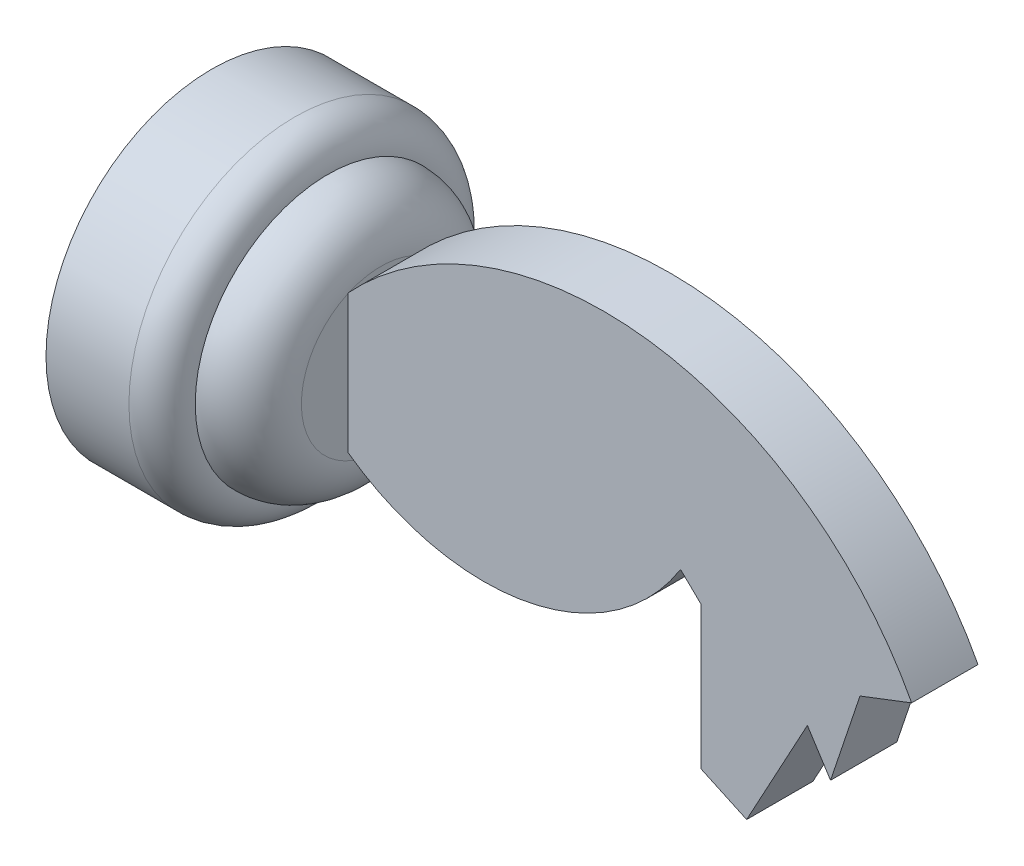
ISO-10303-21;
HEADER;
FILE_DESCRIPTION(('STEP AP214'),'2;1');
FILE_NAME('part.step','',(''),(''),'','','');
FILE_SCHEMA(('AUTOMOTIVE_DESIGN { 1 0 10303 214 1 1 1 1 }'));
ENDSEC;
DATA;
#1=APPLICATION_CONTEXT('core data for automotive mechanical design processes');
#2=APPLICATION_PROTOCOL_DEFINITION('international standard','automotive_design',2000,#1);
#3=PRODUCT_CONTEXT('',#1,'mechanical');
#4=PRODUCT('Part','Part','',(#3));
#5=PRODUCT_RELATED_PRODUCT_CATEGORY('part','',(#4));
#6=PRODUCT_DEFINITION_FORMATION('','',#4);
#7=PRODUCT_DEFINITION_CONTEXT('part definition',#1,'design');
#8=PRODUCT_DEFINITION('design','',#6,#7);
#9=PRODUCT_DEFINITION_SHAPE('','',#8);
#10=(LENGTH_UNIT() NAMED_UNIT(*) SI_UNIT(.MILLI.,.METRE.));
#11=(NAMED_UNIT(*) PLANE_ANGLE_UNIT() SI_UNIT($,.RADIAN.));
#12=(NAMED_UNIT(*) SI_UNIT($,.STERADIAN.) SOLID_ANGLE_UNIT());
#13=UNCERTAINTY_MEASURE_WITH_UNIT(LENGTH_MEASURE(1.E-05),#10,'distance_accuracy_value','');
#14=(GEOMETRIC_REPRESENTATION_CONTEXT(3) GLOBAL_UNCERTAINTY_ASSIGNED_CONTEXT((#13)) GLOBAL_UNIT_ASSIGNED_CONTEXT((#10,
#11,#12)) REPRESENTATION_CONTEXT('',''));
#15=CARTESIAN_POINT('',(0.,0.,0.));
#16=DIRECTION('',(0.,0.,1.));
#17=DIRECTION('',(1.,0.,0.));
#18=AXIS2_PLACEMENT_3D('',#15,#16,#17);
#19=CARTESIAN_POINT('',(11.2,0.,0.));
#20=DIRECTION('',(1.,0.,0.));
#21=DIRECTION('',(0.,0.,-1.));
#22=AXIS2_PLACEMENT_3D('',#19,#20,#21);
#23=PLANE('',#22);
#24=DIRECTION('',(0.,0.,-1.));
#25=VECTOR('',#24,1.);
#26=CARTESIAN_POINT('',(11.2,4.4,2.));
#27=LINE('',#26,#25);
#28=CARTESIAN_POINT('',(11.2,4.4,1.91833260932509));
#29=VERTEX_POINT('',#28);
#30=CARTESIAN_POINT('',(11.2,4.4,-1.91833260932509));
#31=VERTEX_POINT('',#30);
#32=EDGE_CURVE('E156',#29,#31,#27,.T.);
#33=ORIENTED_EDGE('',*,*,#32,.T.);
#34=CARTESIAN_POINT('',(11.2,0.,0.));
#35=DIRECTION('',(-1.,0.,0.));
#36=DIRECTION('',(0.,0.,1.));
#37=AXIS2_PLACEMENT_3D('',#34,#35,#36);
#38=CIRCLE('',#37,4.8);
#39=EDGE_CURVE('E236',#29,#31,#38,.T.);
#40=ORIENTED_EDGE('',*,*,#39,.F.);
#41=EDGE_LOOP('',(#33,#40));
#42=FACE_BOUND('',#41,.T.);
#43=ADVANCED_FACE('F46',(#42),#23,.T.);
#44=CARTESIAN_POINT('',(0.,0.,0.));
#45=DIRECTION('',(-1.,0.,0.));
#46=DIRECTION('',(0.,0.,1.));
#47=AXIS2_PLACEMENT_3D('',#44,#45,#46);
#48=CYLINDRICAL_SURFACE('',#47,10.);
#49=CARTESIAN_POINT('',(6.,0.,0.));
#50=DIRECTION('',(-1.,0.,0.));
#51=DIRECTION('',(0.,0.,1.));
#52=AXIS2_PLACEMENT_3D('',#49,#50,#51);
#53=CIRCLE('',#52,10.);
#54=CARTESIAN_POINT('',(6.,0.,10.));
#55=VERTEX_POINT('',#54);
#56=EDGE_CURVE('E157',#55,#55,#53,.T.);
#57=ORIENTED_EDGE('',*,*,#56,.T.);
#58=EDGE_LOOP('',(#57));
#59=FACE_BOUND('',#58,.T.);
#60=CARTESIAN_POINT('',(0.999999999999999,0.,0.));
#61=DIRECTION('',(-1.,0.,0.));
#62=DIRECTION('',(0.,0.,1.));
#63=AXIS2_PLACEMENT_3D('',#60,#61,#62);
#64=CIRCLE('',#63,10.);
#65=CARTESIAN_POINT('',(0.999999999999999,0.,10.));
#66=VERTEX_POINT('',#65);
#67=EDGE_CURVE('E11',#66,#66,#64,.T.);
#68=ORIENTED_EDGE('',*,*,#67,.F.);
#69=EDGE_LOOP('',(#68));
#70=FACE_BOUND('',#69,.T.);
#71=ADVANCED_FACE('F48',(#59,#70),#48,.T.);
#72=CARTESIAN_POINT('',(0.999999999999999,0.,0.));
#73=DIRECTION('',(1.,0.,0.));
#74=DIRECTION('',(0.,0.,-1.));
#75=AXIS2_PLACEMENT_3D('',#72,#73,#74);
#76=PLANE('',#75);
#77=ORIENTED_EDGE('',*,*,#67,.T.);
#78=EDGE_LOOP('',(#77));
#79=FACE_BOUND('',#78,.T.);
#80=ADVANCED_FACE('F255',(#79),#76,.F.);
#81=DIRECTION('',(0.,1.,0.));
#82=VECTOR('',#81,1.);
#83=CARTESIAN_POINT('',(11.2,0.,2.));
#84=LINE('',#83,#82);
#85=CARTESIAN_POINT('',(11.2,-3.91497825520678,2.));
#86=VERTEX_POINT('',#85);
#87=CARTESIAN_POINT('',(11.2,4.36348484585429,2.));
#88=VERTEX_POINT('',#87);
#89=EDGE_CURVE('E148',#86,#88,#84,.T.);
#90=ORIENTED_EDGE('',*,*,#89,.T.);
#91=CARTESIAN_POINT('',(11.2,4.36348484585429,-2.));
#92=VERTEX_POINT('',#91);
#93=EDGE_CURVE('E233',#92,#88,#38,.T.);
#94=ORIENTED_EDGE('',*,*,#93,.F.);
#95=DIRECTION('',(0.,1.,0.));
#96=VECTOR('',#95,1.);
#97=CARTESIAN_POINT('',(11.2,0.,-2.));
#98=LINE('',#97,#96);
#99=CARTESIAN_POINT('',(11.2,-3.91497825520678,-2.));
#100=VERTEX_POINT('',#99);
#101=EDGE_CURVE('E62',#100,#92,#98,.T.);
#102=ORIENTED_EDGE('',*,*,#101,.F.);
#103=DIRECTION('',(0.,0.,-1.));
#104=VECTOR('',#103,1.);
#105=CARTESIAN_POINT('',(11.2,-3.91497825520678,2.));
#106=LINE('',#105,#104);
#107=EDGE_CURVE('E226',#86,#100,#106,.T.);
#108=ORIENTED_EDGE('',*,*,#107,.F.);
#109=EDGE_LOOP('',(#90,#94,#102,#108));
#110=FACE_BOUND('',#109,.T.);
#111=ADVANCED_FACE('F257',(#110),#23,.T.);
#112=CARTESIAN_POINT('',(8.,0.,0.));
#113=DIRECTION('',(-1.,0.,0.));
#114=DIRECTION('',(0.,0.,1.));
#115=AXIS2_PLACEMENT_3D('',#112,#113,#114);
#116=TOROIDAL_SURFACE('',#115,4.8,3.2);
#117=CARTESIAN_POINT('',(8.,0.,0.));
#118=DIRECTION('',(-1.,0.,0.));
#119=DIRECTION('',(0.,0.,1.));
#120=AXIS2_PLACEMENT_3D('',#117,#118,#119);
#121=CIRCLE('',#120,8.);
#122=CARTESIAN_POINT('',(8.,0.,8.));
#123=VERTEX_POINT('',#122);
#124=EDGE_CURVE('E230',#123,#123,#121,.T.);
#125=ORIENTED_EDGE('',*,*,#124,.F.);
#126=EDGE_LOOP('',(#125));
#127=FACE_BOUND('',#126,.T.);
#128=EDGE_CURVE('E144',#88,#29,#38,.T.);
#129=ORIENTED_EDGE('',*,*,#128,.T.);
#130=ORIENTED_EDGE('',*,*,#39,.T.);
#131=EDGE_CURVE('E69',#31,#92,#38,.T.);
#132=ORIENTED_EDGE('',*,*,#131,.T.);
#133=ORIENTED_EDGE('',*,*,#93,.T.);
#134=EDGE_LOOP('',(#129,#130,#132,#133));
#135=FACE_BOUND('',#134,.T.);
#136=ADVANCED_FACE('F263',(#127,#135),#116,.T.);
#137=CARTESIAN_POINT('',(6.,0.,0.));
#138=DIRECTION('',(-1.,0.,0.));
#139=DIRECTION('',(0.,0.,1.));
#140=AXIS2_PLACEMENT_3D('',#137,#138,#139);
#141=TOROIDAL_SURFACE('',#140,8.,2.);
#142=ORIENTED_EDGE('',*,*,#124,.T.);
#143=EDGE_LOOP('',(#142));
#144=FACE_BOUND('',#143,.T.);
#145=ORIENTED_EDGE('',*,*,#56,.F.);
#146=EDGE_LOOP('',(#145));
#147=FACE_BOUND('',#146,.T.);
#148=ADVANCED_FACE('F294',(#144,#147),#141,.T.);
#149=CARTESIAN_POINT('',(11.2,0.,2.));
#150=DIRECTION('',(-1.,0.,0.));
#151=DIRECTION('',(0.,0.,1.));
#152=AXIS2_PLACEMENT_3D('',#149,#150,#151);
#153=PLANE('',#152);
#154=ORIENTED_EDGE('',*,*,#128,.F.);
#155=CARTESIAN_POINT('',(11.2,4.4,2.));
#156=VERTEX_POINT('',#155);
#157=EDGE_CURVE('E138',#88,#156,#84,.T.);
#158=ORIENTED_EDGE('',*,*,#157,.T.);
#159=EDGE_CURVE('E141',#156,#29,#27,.T.);
#160=ORIENTED_EDGE('',*,*,#159,.T.);
#161=EDGE_LOOP('',(#154,#158,#160));
#162=FACE_BOUND('',#161,.T.);
#163=ADVANCED_FACE('F140',(#162),#153,.T.);
#164=CARTESIAN_POINT('',(26.6430950023222,-9.83062952751044,2.));
#165=DIRECTION('',(0.,0.,-1.));
#166=DIRECTION('',(-1.,0.,0.));
#167=AXIS2_PLACEMENT_3D('',#164,#165,#166);
#168=CYLINDRICAL_SURFACE('',#167,21.);
#169=CARTESIAN_POINT('',(26.6430950023222,-9.83062952751044,-2.));
#170=DIRECTION('',(0.,0.,1.));
#171=DIRECTION('',(1.,0.,0.));
#172=AXIS2_PLACEMENT_3D('',#169,#170,#171);
#173=CIRCLE('',#172,21.);
#174=CARTESIAN_POINT('',(11.2,4.4,-2.));
#175=VERTEX_POINT('',#174);
#176=CARTESIAN_POINT('',(45.2,0.,-2.));
#177=VERTEX_POINT('',#176);
#178=EDGE_CURVE('E187',#175,#177,#173,.F.);
#179=ORIENTED_EDGE('',*,*,#178,.F.);
#180=EDGE_CURVE('E159',#31,#175,#27,.T.);
#181=ORIENTED_EDGE('',*,*,#180,.F.);
#182=ORIENTED_EDGE('',*,*,#32,.F.);
#183=ORIENTED_EDGE('',*,*,#159,.F.);
#184=CARTESIAN_POINT('',(26.6430950023222,-9.83062952751044,2.));
#185=DIRECTION('',(0.,0.,1.));
#186=DIRECTION('',(1.,0.,0.));
#187=AXIS2_PLACEMENT_3D('',#184,#185,#186);
#188=CIRCLE('',#187,21.);
#189=CARTESIAN_POINT('',(45.2,0.,2.));
#190=VERTEX_POINT('',#189);
#191=EDGE_CURVE('E149',#156,#190,#188,.F.);
#192=ORIENTED_EDGE('',*,*,#191,.T.);
#193=DIRECTION('',(0.,0.,-1.));
#194=VECTOR('',#193,1.);
#195=CARTESIAN_POINT('',(45.2,0.,2.));
#196=LINE('',#195,#194);
#197=EDGE_CURVE('E186',#190,#177,#196,.T.);
#198=ORIENTED_EDGE('',*,*,#197,.T.);
#199=EDGE_LOOP('',(#179,#181,#182,#183,#192,#198));
#200=FACE_BOUND('',#199,.T.);
#201=ADVANCED_FACE('F154',(#200),#168,.T.);
#202=ORIENTED_EDGE('',*,*,#131,.F.);
#203=ORIENTED_EDGE('',*,*,#180,.T.);
#204=EDGE_CURVE('E190',#92,#175,#98,.T.);
#205=ORIENTED_EDGE('',*,*,#204,.F.);
#206=EDGE_LOOP('',(#202,#203,#205));
#207=FACE_BOUND('',#206,.T.);
#208=ADVANCED_FACE('F332',(#207),#153,.T.);
#209=CARTESIAN_POINT('',(19.3994308478551,7.43267937847441,2.));
#210=DIRECTION('',(0.,0.,-1.));
#211=DIRECTION('',(-1.,0.,0.));
#212=AXIS2_PLACEMENT_3D('',#209,#210,#211);
#213=CYLINDRICAL_SURFACE('',#212,14.);
#214=CARTESIAN_POINT('',(19.3994308478551,7.43267937847441,-2.));
#215=DIRECTION('',(0.,0.,1.));
#216=DIRECTION('',(1.,0.,0.));
#217=AXIS2_PLACEMENT_3D('',#214,#215,#216);
#218=CIRCLE('',#217,14.);
#219=CARTESIAN_POINT('',(31.263463773332,0.,-2.));
#220=VERTEX_POINT('',#219);
#221=EDGE_CURVE('E192',#220,#100,#218,.F.);
#222=ORIENTED_EDGE('',*,*,#221,.F.);
#223=DIRECTION('',(0.,0.,-1.));
#224=VECTOR('',#223,1.);
#225=CARTESIAN_POINT('',(31.263463773332,0.,2.));
#226=LINE('',#225,#224);
#227=CARTESIAN_POINT('',(31.263463773332,0.,2.));
#228=VERTEX_POINT('',#227);
#229=EDGE_CURVE('E224',#228,#220,#226,.T.);
#230=ORIENTED_EDGE('',*,*,#229,.F.);
#231=CARTESIAN_POINT('',(19.3994308478551,7.43267937847441,2.));
#232=DIRECTION('',(0.,0.,1.));
#233=DIRECTION('',(1.,0.,0.));
#234=AXIS2_PLACEMENT_3D('',#231,#232,#233);
#235=CIRCLE('',#234,14.);
#236=EDGE_CURVE('E170',#228,#86,#235,.F.);
#237=ORIENTED_EDGE('',*,*,#236,.T.);
#238=ORIENTED_EDGE('',*,*,#107,.T.);
#239=EDGE_LOOP('',(#222,#230,#237,#238));
#240=FACE_BOUND('',#239,.T.);
#241=ADVANCED_FACE('F347',(#240),#213,.T.);
#242=CARTESIAN_POINT('',(15.1403569656046,15.6240069272758,2.));
#243=DIRECTION('',(0.695904285191115,0.71813454578696,0.));
#244=DIRECTION('',(-0.71813454578696,0.695904285191115,0.));
#245=AXIS2_PLACEMENT_3D('',#242,#243,#244);
#246=PLANE('',#245);
#247=DIRECTION('',(0.71813454578696,-0.695904285191115,0.));
#248=VECTOR('',#247,1.);
#249=CARTESIAN_POINT('',(15.1403569656046,15.6240069272758,-2.));
#250=LINE('',#249,#248);
#251=CARTESIAN_POINT('',(32.498964702066,-1.19725529945281,-2.));
#252=VERTEX_POINT('',#251);
#253=EDGE_CURVE('E194',#220,#252,#250,.T.);
#254=ORIENTED_EDGE('',*,*,#253,.T.);
#255=DIRECTION('',(0.,0.,-1.));
#256=VECTOR('',#255,1.);
#257=CARTESIAN_POINT('',(32.498964702066,-1.19725529945281,2.));
#258=LINE('',#257,#256);
#259=CARTESIAN_POINT('',(32.498964702066,-1.19725529945281,2.));
#260=VERTEX_POINT('',#259);
#261=EDGE_CURVE('E221',#260,#252,#258,.T.);
#262=ORIENTED_EDGE('',*,*,#261,.F.);
#263=DIRECTION('',(0.71813454578696,-0.695904285191115,0.));
#264=VECTOR('',#263,1.);
#265=CARTESIAN_POINT('',(15.1403569656046,15.6240069272758,2.));
#266=LINE('',#265,#264);
#267=EDGE_CURVE('E173',#228,#260,#266,.T.);
#268=ORIENTED_EDGE('',*,*,#267,.F.);
#269=ORIENTED_EDGE('',*,*,#229,.T.);
#270=EDGE_LOOP('',(#254,#262,#268,#269));
#271=FACE_BOUND('',#270,.T.);
#272=ADVANCED_FACE('F353',(#271),#246,.F.);
#273=CARTESIAN_POINT('',(32.498964702066,0.,2.));
#274=DIRECTION('',(1.,0.,0.));
#275=DIRECTION('',(0.,0.,-1.));
#276=AXIS2_PLACEMENT_3D('',#273,#274,#275);
#277=PLANE('',#276);
#278=DIRECTION('',(0.,-1.,0.));
#279=VECTOR('',#278,1.);
#280=CARTESIAN_POINT('',(32.498964702066,0.,-2.));
#281=LINE('',#280,#279);
#282=CARTESIAN_POINT('',(32.498964702066,-9.79725529945281,-2.));
#283=VERTEX_POINT('',#282);
#284=EDGE_CURVE('E196',#252,#283,#281,.T.);
#285=ORIENTED_EDGE('',*,*,#284,.T.);
#286=DIRECTION('',(0.,0.,-1.));
#287=VECTOR('',#286,1.);
#288=CARTESIAN_POINT('',(32.498964702066,-9.79725529945281,2.));
#289=LINE('',#288,#287);
#290=CARTESIAN_POINT('',(32.498964702066,-9.79725529945281,2.));
#291=VERTEX_POINT('',#290);
#292=EDGE_CURVE('E218',#291,#283,#289,.T.);
#293=ORIENTED_EDGE('',*,*,#292,.F.);
#294=DIRECTION('',(0.,-1.,0.));
#295=VECTOR('',#294,1.);
#296=CARTESIAN_POINT('',(32.498964702066,0.,2.));
#297=LINE('',#296,#295);
#298=EDGE_CURVE('E175',#260,#291,#297,.T.);
#299=ORIENTED_EDGE('',*,*,#298,.F.);
#300=ORIENTED_EDGE('',*,*,#261,.T.);
#301=EDGE_LOOP('',(#285,#293,#299,#300));
#302=FACE_BOUND('',#301,.T.);
#303=ADVANCED_FACE('F362',(#302),#277,.F.);
#304=CARTESIAN_POINT('',(1.99946445082386,4.3197897508319,2.));
#305=DIRECTION('',(0.420047755956167,0.907502001494316,0.));
#306=DIRECTION('',(-0.907502001494316,0.420047755956167,0.));
#307=AXIS2_PLACEMENT_3D('',#304,#305,#306);
#308=PLANE('',#307);
#309=DIRECTION('',(0.907502001494316,-0.420047755956167,0.));
#310=VECTOR('',#309,1.);
#311=CARTESIAN_POINT('',(1.99946445082386,4.3197897508319,-2.));
#312=LINE('',#311,#310);
#313=CARTESIAN_POINT('',(35.2486957665938,-11.07,-2.));
#314=VERTEX_POINT('',#313);
#315=EDGE_CURVE('E198',#283,#314,#312,.T.);
#316=ORIENTED_EDGE('',*,*,#315,.T.);
#317=DIRECTION('',(0.,0.,-1.));
#318=VECTOR('',#317,1.);
#319=CARTESIAN_POINT('',(35.2486957665938,-11.07,2.));
#320=LINE('',#319,#318);
#321=CARTESIAN_POINT('',(35.2486957665938,-11.07,2.));
#322=VERTEX_POINT('',#321);
#323=EDGE_CURVE('E215',#322,#314,#320,.T.);
#324=ORIENTED_EDGE('',*,*,#323,.F.);
#325=DIRECTION('',(0.907502001494316,-0.420047755956167,0.));
#326=VECTOR('',#325,1.);
#327=CARTESIAN_POINT('',(1.99946445082386,4.3197897508319,2.));
#328=LINE('',#327,#326);
#329=EDGE_CURVE('E177',#291,#322,#328,.T.);
#330=ORIENTED_EDGE('',*,*,#329,.F.);
#331=ORIENTED_EDGE('',*,*,#292,.T.);
#332=EDGE_LOOP('',(#316,#324,#330,#331));
#333=FACE_BOUND('',#332,.T.);
#334=ADVANCED_FACE('F371',(#333),#308,.F.);
#335=CARTESIAN_POINT('',(31.8696932080387,-17.2961223907554,2.));
#336=DIRECTION('',(-0.87890625,0.47699455312502,0.));
#337=DIRECTION('',(-0.47699455312502,-0.87890625,0.));
#338=AXIS2_PLACEMENT_3D('',#335,#336,#337);
#339=PLANE('',#338);
#340=DIRECTION('',(0.47699455312502,0.87890625,0.));
#341=VECTOR('',#340,1.);
#342=CARTESIAN_POINT('',(31.8696932080387,-17.2961223907554,-2.));
#343=LINE('',#342,#341);
#344=CARTESIAN_POINT('',(38.9120139345939,-4.32,-2.));
#345=VERTEX_POINT('',#344);
#346=EDGE_CURVE('E200',#314,#345,#343,.T.);
#347=ORIENTED_EDGE('',*,*,#346,.T.);
#348=DIRECTION('',(0.,0.,-1.));
#349=VECTOR('',#348,1.);
#350=CARTESIAN_POINT('',(38.9120139345939,-4.32,2.));
#351=LINE('',#350,#349);
#352=CARTESIAN_POINT('',(38.9120139345939,-4.32,2.));
#353=VERTEX_POINT('',#352);
#354=EDGE_CURVE('E212',#353,#345,#351,.T.);
#355=ORIENTED_EDGE('',*,*,#354,.F.);
#356=DIRECTION('',(0.47699455312502,0.87890625,0.));
#357=VECTOR('',#356,1.);
#358=CARTESIAN_POINT('',(31.8696932080387,-17.2961223907554,2.));
#359=LINE('',#358,#357);
#360=EDGE_CURVE('E179',#322,#353,#359,.T.);
#361=ORIENTED_EDGE('',*,*,#360,.F.);
#362=ORIENTED_EDGE('',*,*,#323,.T.);
#363=EDGE_LOOP('',(#347,#355,#361,#362));
#364=FACE_BOUND('',#363,.T.);
#365=ADVANCED_FACE('F380',(#364),#339,.F.);
#366=CARTESIAN_POINT('',(25.561946300607,16.4389062035767,2.));
#367=DIRECTION('',(0.84108527131783,0.540902547943909,0.));
#368=DIRECTION('',(-0.540902547943909,0.84108527131783,0.));
#369=AXIS2_PLACEMENT_3D('',#366,#367,#368);
#370=PLANE('',#369);
#371=DIRECTION('',(0.540902547943909,-0.84108527131783,0.));
#372=VECTOR('',#371,1.);
#373=CARTESIAN_POINT('',(25.561946300607,16.4389062035767,-2.));
#374=LINE('',#373,#372);
#375=CARTESIAN_POINT('',(40.3075425082892,-6.49,-2.));
#376=VERTEX_POINT('',#375);
#377=EDGE_CURVE('E202',#345,#376,#374,.T.);
#378=ORIENTED_EDGE('',*,*,#377,.T.);
#379=DIRECTION('',(0.,0.,-1.));
#380=VECTOR('',#379,1.);
#381=CARTESIAN_POINT('',(40.3075425082892,-6.49,2.));
#382=LINE('',#381,#380);
#383=CARTESIAN_POINT('',(40.3075425082892,-6.49,2.));
#384=VERTEX_POINT('',#383);
#385=EDGE_CURVE('E209',#384,#376,#382,.T.);
#386=ORIENTED_EDGE('',*,*,#385,.F.);
#387=DIRECTION('',(0.540902547943909,-0.84108527131783,0.));
#388=VECTOR('',#387,1.);
#389=CARTESIAN_POINT('',(25.561946300607,16.4389062035767,2.));
#390=LINE('',#389,#388);
#391=EDGE_CURVE('E181',#353,#384,#390,.T.);
#392=ORIENTED_EDGE('',*,*,#391,.F.);
#393=ORIENTED_EDGE('',*,*,#354,.T.);
#394=EDGE_LOOP('',(#378,#386,#392,#393));
#395=FACE_BOUND('',#394,.T.);
#396=ADVANCED_FACE('F389',(#395),#370,.F.);
#397=CARTESIAN_POINT('',(38.1844392608772,-12.8157644415364,2.));
#398=DIRECTION('',(-0.948028673835126,0.318184904711731,0.));
#399=DIRECTION('',(-0.318184904711731,-0.948028673835126,0.));
#400=AXIS2_PLACEMENT_3D('',#397,#398,#399);
#401=PLANE('',#400);
#402=DIRECTION('',(0.318184904711731,0.948028673835126,0.));
#403=VECTOR('',#402,1.);
#404=CARTESIAN_POINT('',(38.1844392608772,-12.8157644415364,-2.));
#405=LINE('',#404,#403);
#406=CARTESIAN_POINT('',(42.0830142765807,-1.2,-2.));
#407=VERTEX_POINT('',#406);
#408=EDGE_CURVE('E167',#376,#407,#405,.T.);
#409=ORIENTED_EDGE('',*,*,#408,.T.);
#410=DIRECTION('',(0.,0.,-1.));
#411=VECTOR('',#410,1.);
#412=CARTESIAN_POINT('',(42.0830142765807,-1.2,2.));
#413=LINE('',#412,#411);
#414=CARTESIAN_POINT('',(42.0830142765807,-1.2,2.));
#415=VERTEX_POINT('',#414);
#416=EDGE_CURVE('E206',#415,#407,#413,.T.);
#417=ORIENTED_EDGE('',*,*,#416,.F.);
#418=DIRECTION('',(0.318184904711731,0.948028673835126,0.));
#419=VECTOR('',#418,1.);
#420=CARTESIAN_POINT('',(38.1844392608772,-12.8157644415364,2.));
#421=LINE('',#420,#419);
#422=EDGE_CURVE('E183',#384,#415,#421,.T.);
#423=ORIENTED_EDGE('',*,*,#422,.F.);
#424=ORIENTED_EDGE('',*,*,#385,.T.);
#425=EDGE_LOOP('',(#409,#417,#423,#424));
#426=FACE_BOUND('',#425,.T.);
#427=ADVANCED_FACE('F398',(#426),#401,.F.);
#428=CARTESIAN_POINT('',(5.83455842805408,-15.1551961022505,2.));
#429=DIRECTION('',(-0.359281437125749,0.933229258508785,0.));
#430=DIRECTION('',(-0.933229258508785,-0.359281437125749,0.));
#431=AXIS2_PLACEMENT_3D('',#428,#429,#430);
#432=PLANE('',#431);
#433=DIRECTION('',(0.933229258508785,0.359281437125749,0.));
#434=VECTOR('',#433,1.);
#435=CARTESIAN_POINT('',(5.83455842805408,-15.1551961022505,-2.));
#436=LINE('',#435,#434);
#437=EDGE_CURVE('E164',#407,#177,#436,.T.);
#438=ORIENTED_EDGE('',*,*,#437,.T.);
#439=ORIENTED_EDGE('',*,*,#197,.F.);
#440=DIRECTION('',(0.933229258508785,0.359281437125749,0.));
#441=VECTOR('',#440,1.);
#442=CARTESIAN_POINT('',(5.83455842805408,-15.1551961022505,2.));
#443=LINE('',#442,#441);
#444=EDGE_CURVE('E162',#415,#190,#443,.T.);
#445=ORIENTED_EDGE('',*,*,#444,.F.);
#446=ORIENTED_EDGE('',*,*,#416,.T.);
#447=EDGE_LOOP('',(#438,#439,#445,#446));
#448=FACE_BOUND('',#447,.T.);
#449=ADVANCED_FACE('F407',(#448),#432,.F.);
#450=CARTESIAN_POINT('',(0.,0.,2.));
#451=DIRECTION('',(0.,0.,1.));
#452=DIRECTION('',(1.,0.,0.));
#453=AXIS2_PLACEMENT_3D('',#450,#451,#452);
#454=PLANE('',#453);
#455=ORIENTED_EDGE('',*,*,#191,.F.);
#456=ORIENTED_EDGE('',*,*,#157,.F.);
#457=ORIENTED_EDGE('',*,*,#89,.F.);
#458=ORIENTED_EDGE('',*,*,#236,.F.);
#459=ORIENTED_EDGE('',*,*,#267,.T.);
#460=ORIENTED_EDGE('',*,*,#298,.T.);
#461=ORIENTED_EDGE('',*,*,#329,.T.);
#462=ORIENTED_EDGE('',*,*,#360,.T.);
#463=ORIENTED_EDGE('',*,*,#391,.T.);
#464=ORIENTED_EDGE('',*,*,#422,.T.);
#465=ORIENTED_EDGE('',*,*,#444,.T.);
#466=EDGE_LOOP('',(#455,#456,#457,#458,#459,#460,#461,#462,#463,#464,#465));
#467=FACE_BOUND('',#466,.T.);
#468=ADVANCED_FACE('F160',(#467),#454,.T.);
#469=CARTESIAN_POINT('',(0.,0.,-2.));
#470=DIRECTION('',(0.,0.,1.));
#471=DIRECTION('',(1.,0.,0.));
#472=AXIS2_PLACEMENT_3D('',#469,#470,#471);
#473=PLANE('',#472);
#474=ORIENTED_EDGE('',*,*,#178,.T.);
#475=ORIENTED_EDGE('',*,*,#437,.F.);
#476=ORIENTED_EDGE('',*,*,#408,.F.);
#477=ORIENTED_EDGE('',*,*,#377,.F.);
#478=ORIENTED_EDGE('',*,*,#346,.F.);
#479=ORIENTED_EDGE('',*,*,#315,.F.);
#480=ORIENTED_EDGE('',*,*,#284,.F.);
#481=ORIENTED_EDGE('',*,*,#253,.F.);
#482=ORIENTED_EDGE('',*,*,#221,.T.);
#483=ORIENTED_EDGE('',*,*,#101,.T.);
#484=ORIENTED_EDGE('',*,*,#204,.T.);
#485=EDGE_LOOP('',(#474,#475,#476,#477,#478,#479,#480,#481,#482,#483,#484));
#486=FACE_BOUND('',#485,.T.);
#487=ADVANCED_FACE('F425',(#486),#473,.F.);
#488=CLOSED_SHELL('',(#43,#71,#80,#111,#136,#148,#163,#201,#208,#241,#272,#303,#334,#365,#396,
#427,#449,#468,#487));
#489=CARTESIAN_POINT('',(2.,0.,0.));
#490=DIRECTION('',(-1.,0.,0.));
#491=DIRECTION('',(0.,0.,1.));
#492=AXIS2_PLACEMENT_3D('',#489,#490,#491);
#493=PLANE('',#492);
#494=CARTESIAN_POINT('',(2.,0.,0.));
#495=DIRECTION('',(-1.,0.,0.));
#496=DIRECTION('',(0.,0.,1.));
#497=AXIS2_PLACEMENT_3D('',#494,#495,#496);
#498=CIRCLE('',#497,5.25);
#499=CARTESIAN_POINT('',(2.,0.,5.25));
#500=VERTEX_POINT('',#499);
#501=EDGE_CURVE('E55',#500,#500,#498,.T.);
#502=ORIENTED_EDGE('',*,*,#501,.F.);
#503=EDGE_LOOP('',(#502));
#504=FACE_BOUND('',#503,.T.);
#505=ADVANCED_FACE('F243',(#504),#493,.F.);
#506=CARTESIAN_POINT('',(0.,0.,0.));
#507=DIRECTION('',(-1.,0.,0.));
#508=DIRECTION('',(0.,0.,1.));
#509=AXIS2_PLACEMENT_3D('',#506,#507,#508);
#510=CYLINDRICAL_SURFACE('',#509,5.25);
#511=CARTESIAN_POINT('',(4.5,0.,0.));
#512=DIRECTION('',(-1.,0.,0.));
#513=DIRECTION('',(0.,0.,1.));
#514=AXIS2_PLACEMENT_3D('',#511,#512,#513);
#515=CIRCLE('',#514,5.25);
#516=CARTESIAN_POINT('',(4.5,0.,5.25));
#517=VERTEX_POINT('',#516);
#518=EDGE_CURVE('E235',#517,#517,#515,.T.);
#519=ORIENTED_EDGE('',*,*,#518,.F.);
#520=EDGE_LOOP('',(#519));
#521=FACE_BOUND('',#520,.T.);
#522=ORIENTED_EDGE('',*,*,#501,.T.);
#523=EDGE_LOOP('',(#522));
#524=FACE_BOUND('',#523,.T.);
#525=ADVANCED_FACE('F241',(#521,#524),#510,.F.);
#526=CARTESIAN_POINT('',(4.5,0.,0.));
#527=DIRECTION('',(1.,0.,0.));
#528=DIRECTION('',(0.,0.,-1.));
#529=AXIS2_PLACEMENT_3D('',#526,#527,#528);
#530=PLANE('',#529);
#531=ORIENTED_EDGE('',*,*,#518,.T.);
#532=EDGE_LOOP('',(#531));
#533=FACE_BOUND('',#532,.T.);
#534=ADVANCED_FACE('F251',(#533),#530,.F.);
#535=CLOSED_SHELL('',(#505,#525,#534));
#536=ORIENTED_CLOSED_SHELL('',*,#535,.T.);
#537=BREP_WITH_VOIDS('B2',#488,(#536));
#538=ADVANCED_BREP_SHAPE_REPRESENTATION('',(#18,#537),#14);
#539=SHAPE_DEFINITION_REPRESENTATION(#9,#538);
ENDSEC;
END-ISO-10303-21;
